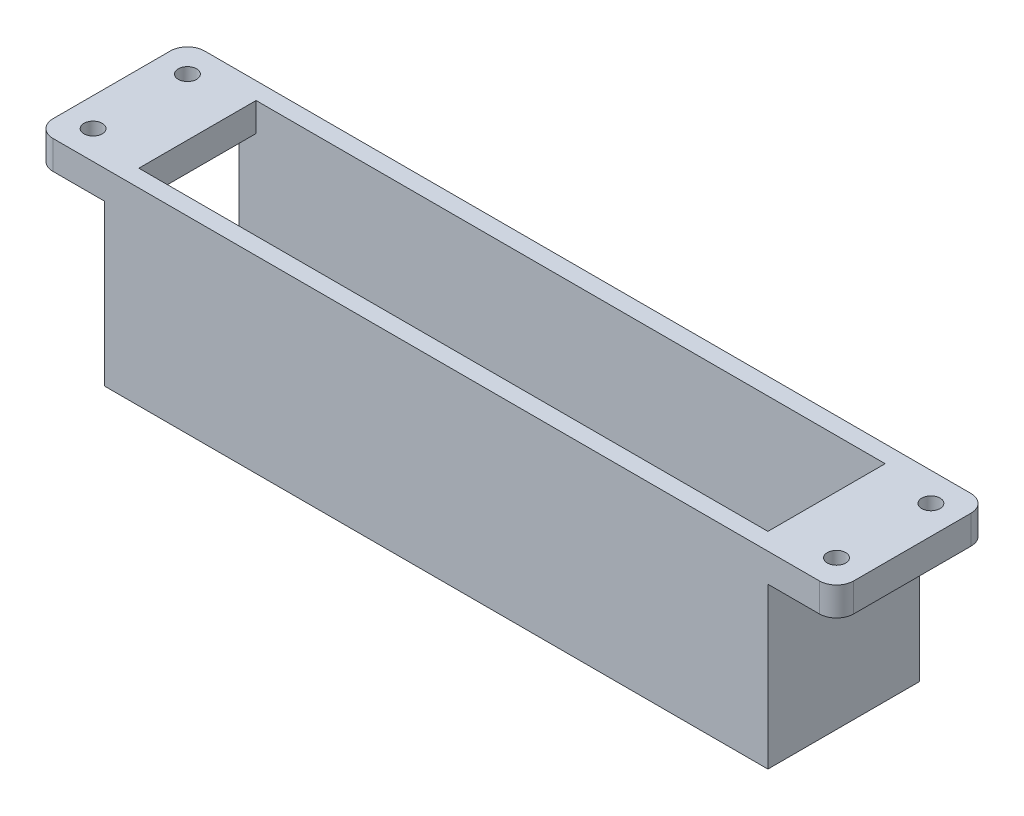
ISO-10303-21;
HEADER;
FILE_DESCRIPTION(('STEP AP214'),'2;1');
FILE_NAME('part.step','',(''),(''),'','','');
FILE_SCHEMA(('AUTOMOTIVE_DESIGN { 1 0 10303 214 1 1 1 1 }'));
ENDSEC;
DATA;
#1=APPLICATION_CONTEXT('core data for automotive mechanical design processes');
#2=APPLICATION_PROTOCOL_DEFINITION('international standard','automotive_design',2000,#1);
#3=PRODUCT_CONTEXT('',#1,'mechanical');
#4=PRODUCT('Part','Part','',(#3));
#5=PRODUCT_RELATED_PRODUCT_CATEGORY('part','',(#4));
#6=PRODUCT_DEFINITION_FORMATION('','',#4);
#7=PRODUCT_DEFINITION_CONTEXT('part definition',#1,'design');
#8=PRODUCT_DEFINITION('design','',#6,#7);
#9=PRODUCT_DEFINITION_SHAPE('','',#8);
#10=(LENGTH_UNIT() NAMED_UNIT(*) SI_UNIT(.MILLI.,.METRE.));
#11=(NAMED_UNIT(*) PLANE_ANGLE_UNIT() SI_UNIT($,.RADIAN.));
#12=(NAMED_UNIT(*) SI_UNIT($,.STERADIAN.) SOLID_ANGLE_UNIT());
#13=UNCERTAINTY_MEASURE_WITH_UNIT(LENGTH_MEASURE(1.E-05),#10,'distance_accuracy_value','');
#14=(GEOMETRIC_REPRESENTATION_CONTEXT(3) GLOBAL_UNCERTAINTY_ASSIGNED_CONTEXT((#13)) GLOBAL_UNIT_ASSIGNED_CONTEXT((#10,
#11,#12)) REPRESENTATION_CONTEXT('',''));
#15=CARTESIAN_POINT('',(0.,0.,0.));
#16=DIRECTION('',(0.,0.,1.));
#17=DIRECTION('',(1.,0.,0.));
#18=AXIS2_PLACEMENT_3D('',#15,#16,#17);
#19=CARTESIAN_POINT('',(0.,0.,26.5));
#20=DIRECTION('',(1.,0.,0.));
#21=DIRECTION('',(0.,0.,-1.));
#22=AXIS2_PLACEMENT_3D('',#19,#20,#21);
#23=PLANE('',#22);
#24=DIRECTION('',(0.,0.,1.));
#25=VECTOR('',#24,1.);
#26=CARTESIAN_POINT('',(0.,3.,3.));
#27=LINE('',#26,#25);
#28=CARTESIAN_POINT('',(0.,3.,3.));
#29=VERTEX_POINT('',#28);
#30=CARTESIAN_POINT('',(0.,3.,23.5));
#31=VERTEX_POINT('',#30);
#32=EDGE_CURVE('E344',#29,#31,#27,.T.);
#33=ORIENTED_EDGE('',*,*,#32,.F.);
#34=DIRECTION('',(0.,-1.,0.));
#35=VECTOR('',#34,1.);
#36=CARTESIAN_POINT('',(0.,28.,3.));
#37=LINE('',#36,#35);
#38=CARTESIAN_POINT('',(0.,28.,3.));
#39=VERTEX_POINT('',#38);
#40=EDGE_CURVE('E342',#39,#29,#37,.T.);
#41=ORIENTED_EDGE('',*,*,#40,.F.);
#42=DIRECTION('',(0.,0.,-1.));
#43=VECTOR('',#42,1.);
#44=CARTESIAN_POINT('',(0.,28.,26.5));
#45=LINE('',#44,#43);
#46=CARTESIAN_POINT('',(0.,28.,0.));
#47=VERTEX_POINT('',#46);
#48=EDGE_CURVE('E218',#39,#47,#45,.T.);
#49=ORIENTED_EDGE('',*,*,#48,.T.);
#50=DIRECTION('',(0.,-1.,0.));
#51=VECTOR('',#50,1.);
#52=CARTESIAN_POINT('',(0.,0.,0.));
#53=LINE('',#52,#51);
#54=CARTESIAN_POINT('',(0.,0.,0.));
#55=VERTEX_POINT('',#54);
#56=EDGE_CURVE('E200',#47,#55,#53,.T.);
#57=ORIENTED_EDGE('',*,*,#56,.T.);
#58=DIRECTION('',(0.,0.,-1.));
#59=VECTOR('',#58,1.);
#60=CARTESIAN_POINT('',(0.,0.,26.5));
#61=LINE('',#60,#59);
#62=CARTESIAN_POINT('',(0.,0.,26.5));
#63=VERTEX_POINT('',#62);
#64=EDGE_CURVE('E251',#63,#55,#61,.T.);
#65=ORIENTED_EDGE('',*,*,#64,.F.);
#66=DIRECTION('',(0.,-1.,0.));
#67=VECTOR('',#66,1.);
#68=CARTESIAN_POINT('',(0.,0.,26.5));
#69=LINE('',#68,#67);
#70=CARTESIAN_POINT('',(0.,28.,26.5));
#71=VERTEX_POINT('',#70);
#72=EDGE_CURVE('E202',#71,#63,#69,.T.);
#73=ORIENTED_EDGE('',*,*,#72,.F.);
#74=CARTESIAN_POINT('',(0.,28.,23.5));
#75=VERTEX_POINT('',#74);
#76=EDGE_CURVE('E232',#71,#75,#45,.T.);
#77=ORIENTED_EDGE('',*,*,#76,.T.);
#78=DIRECTION('',(0.,1.,0.));
#79=VECTOR('',#78,1.);
#80=CARTESIAN_POINT('',(0.,28.,23.5));
#81=LINE('',#80,#79);
#82=EDGE_CURVE('E172',#31,#75,#81,.T.);
#83=ORIENTED_EDGE('',*,*,#82,.F.);
#84=EDGE_LOOP('',(#33,#41,#49,#57,#65,#73,#77,#83));
#85=FACE_BOUND('',#84,.T.);
#86=ADVANCED_FACE('F41',(#85),#23,.F.);
#87=CARTESIAN_POINT('',(0.,0.,26.5));
#88=DIRECTION('',(0.,1.,0.));
#89=DIRECTION('',(0.,0.,1.));
#90=AXIS2_PLACEMENT_3D('',#87,#88,#89);
#91=PLANE('',#90);
#92=DIRECTION('',(1.,0.,0.));
#93=VECTOR('',#92,1.);
#94=CARTESIAN_POINT('',(0.,0.,0.));
#95=LINE('',#94,#93);
#96=CARTESIAN_POINT('',(116.,0.,0.));
#97=VERTEX_POINT('',#96);
#98=EDGE_CURVE('E221',#55,#97,#95,.T.);
#99=ORIENTED_EDGE('',*,*,#98,.T.);
#100=DIRECTION('',(0.,0.,-1.));
#101=VECTOR('',#100,1.);
#102=CARTESIAN_POINT('',(116.,0.,26.5));
#103=LINE('',#102,#101);
#104=CARTESIAN_POINT('',(116.,0.,26.5));
#105=VERTEX_POINT('',#104);
#106=EDGE_CURVE('E248',#105,#97,#103,.T.);
#107=ORIENTED_EDGE('',*,*,#106,.F.);
#108=DIRECTION('',(1.,0.,0.));
#109=VECTOR('',#108,1.);
#110=CARTESIAN_POINT('',(0.,0.,26.5));
#111=LINE('',#110,#109);
#112=EDGE_CURVE('E205',#63,#105,#111,.T.);
#113=ORIENTED_EDGE('',*,*,#112,.F.);
#114=ORIENTED_EDGE('',*,*,#64,.T.);
#115=EDGE_LOOP('',(#99,#107,#113,#114));
#116=FACE_BOUND('',#115,.T.);
#117=ADVANCED_FACE('F336',(#116),#91,.F.);
#118=CARTESIAN_POINT('',(116.,0.,26.5));
#119=DIRECTION('',(-1.,0.,0.));
#120=DIRECTION('',(0.,0.,1.));
#121=AXIS2_PLACEMENT_3D('',#118,#119,#120);
#122=PLANE('',#121);
#123=DIRECTION('',(0.,1.,0.));
#124=VECTOR('',#123,1.);
#125=CARTESIAN_POINT('',(116.,0.,0.));
#126=LINE('',#125,#124);
#127=CARTESIAN_POINT('',(116.,28.,0.));
#128=VERTEX_POINT('',#127);
#129=EDGE_CURVE('E223',#97,#128,#126,.T.);
#130=ORIENTED_EDGE('',*,*,#129,.T.);
#131=DIRECTION('',(0.,0.,-1.));
#132=VECTOR('',#131,1.);
#133=CARTESIAN_POINT('',(116.,28.,26.5));
#134=LINE('',#133,#132);
#135=CARTESIAN_POINT('',(116.,28.,26.5));
#136=VERTEX_POINT('',#135);
#137=EDGE_CURVE('E245',#136,#128,#134,.T.);
#138=ORIENTED_EDGE('',*,*,#137,.F.);
#139=DIRECTION('',(0.,1.,0.));
#140=VECTOR('',#139,1.);
#141=CARTESIAN_POINT('',(116.,0.,26.5));
#142=LINE('',#141,#140);
#143=EDGE_CURVE('E208',#105,#136,#142,.T.);
#144=ORIENTED_EDGE('',*,*,#143,.F.);
#145=ORIENTED_EDGE('',*,*,#106,.T.);
#146=EDGE_LOOP('',(#130,#138,#144,#145));
#147=FACE_BOUND('',#146,.T.);
#148=ADVANCED_FACE('F332',(#147),#122,.F.);
#149=CARTESIAN_POINT('',(128.,28.,26.5));
#150=DIRECTION('',(0.,1.,0.));
#151=DIRECTION('',(0.,0.,1.));
#152=AXIS2_PLACEMENT_3D('',#149,#150,#151);
#153=PLANE('',#152);
#154=CARTESIAN_POINT('',(123.,28.,21.5));
#155=DIRECTION('',(0.,1.,0.));
#156=DIRECTION('',(0.,0.,1.));
#157=AXIS2_PLACEMENT_3D('',#154,#155,#156);
#158=CIRCLE('',#157,1.60000000000005);
#159=CARTESIAN_POINT('',(123.,28.,23.1));
#160=VERTEX_POINT('',#159);
#161=EDGE_CURVE('E346',#160,#160,#158,.T.);
#162=ORIENTED_EDGE('',*,*,#161,.T.);
#163=EDGE_LOOP('',(#162));
#164=FACE_BOUND('',#163,.T.);
#165=CARTESIAN_POINT('',(123.,28.,5.));
#166=DIRECTION('',(0.,1.,0.));
#167=DIRECTION('',(0.,0.,1.));
#168=AXIS2_PLACEMENT_3D('',#165,#166,#167);
#169=CIRCLE('',#168,1.60000000000005);
#170=CARTESIAN_POINT('',(123.,28.,6.60000000000005));
#171=VERTEX_POINT('',#170);
#172=EDGE_CURVE('E262',#171,#171,#169,.T.);
#173=ORIENTED_EDGE('',*,*,#172,.T.);
#174=EDGE_LOOP('',(#173));
#175=FACE_BOUND('',#174,.T.);
#176=DIRECTION('',(1.,0.,0.));
#177=VECTOR('',#176,1.);
#178=CARTESIAN_POINT('',(128.,28.,0.));
#179=LINE('',#178,#177);
#180=CARTESIAN_POINT('',(125.,28.,0.));
#181=VERTEX_POINT('',#180);
#182=EDGE_CURVE('E225',#128,#181,#179,.T.);
#183=ORIENTED_EDGE('',*,*,#182,.T.);
#184=CARTESIAN_POINT('',(125.,28.,3.));
#185=DIRECTION('',(0.,1.,0.));
#186=DIRECTION('',(0.,0.,1.));
#187=AXIS2_PLACEMENT_3D('',#184,#185,#186);
#188=CIRCLE('',#187,3.);
#189=CARTESIAN_POINT('',(128.,28.,3.));
#190=VERTEX_POINT('',#189);
#191=EDGE_CURVE('E281',#181,#190,#188,.F.);
#192=ORIENTED_EDGE('',*,*,#191,.T.);
#193=DIRECTION('',(0.,0.,-1.));
#194=VECTOR('',#193,1.);
#195=CARTESIAN_POINT('',(128.,28.,26.5));
#196=LINE('',#195,#194);
#197=CARTESIAN_POINT('',(128.,28.,23.5));
#198=VERTEX_POINT('',#197);
#199=EDGE_CURVE('E242',#198,#190,#196,.T.);
#200=ORIENTED_EDGE('',*,*,#199,.F.);
#201=CARTESIAN_POINT('',(125.,28.,23.5));
#202=DIRECTION('',(0.,1.,0.));
#203=DIRECTION('',(0.,0.,1.));
#204=AXIS2_PLACEMENT_3D('',#201,#202,#203);
#205=CIRCLE('',#204,3.);
#206=CARTESIAN_POINT('',(125.,28.,26.5));
#207=VERTEX_POINT('',#206);
#208=EDGE_CURVE('E279',#198,#207,#205,.F.);
#209=ORIENTED_EDGE('',*,*,#208,.T.);
#210=DIRECTION('',(1.,0.,0.));
#211=VECTOR('',#210,1.);
#212=CARTESIAN_POINT('',(128.,28.,26.5));
#213=LINE('',#212,#211);
#214=EDGE_CURVE('E210',#136,#207,#213,.T.);
#215=ORIENTED_EDGE('',*,*,#214,.F.);
#216=ORIENTED_EDGE('',*,*,#137,.T.);
#217=EDGE_LOOP('',(#183,#192,#200,#209,#215,#216));
#218=FACE_BOUND('',#217,.T.);
#219=ADVANCED_FACE('F315',(#164,#175,#218),#153,.F.);
#220=CARTESIAN_POINT('',(128.,33.,26.5));
#221=DIRECTION('',(-1.,0.,0.));
#222=DIRECTION('',(0.,0.,1.));
#223=AXIS2_PLACEMENT_3D('',#220,#221,#222);
#224=PLANE('',#223);
#225=ORIENTED_EDGE('',*,*,#199,.T.);
#226=DIRECTION('',(0.,1.,0.));
#227=VECTOR('',#226,1.);
#228=CARTESIAN_POINT('',(128.,33.,3.));
#229=LINE('',#228,#227);
#230=CARTESIAN_POINT('',(128.,33.,3.));
#231=VERTEX_POINT('',#230);
#232=EDGE_CURVE('E264',#190,#231,#229,.T.);
#233=ORIENTED_EDGE('',*,*,#232,.T.);
#234=DIRECTION('',(0.,0.,-1.));
#235=VECTOR('',#234,1.);
#236=CARTESIAN_POINT('',(128.,33.,26.5));
#237=LINE('',#236,#235);
#238=CARTESIAN_POINT('',(128.,33.,23.5));
#239=VERTEX_POINT('',#238);
#240=EDGE_CURVE('E239',#239,#231,#237,.T.);
#241=ORIENTED_EDGE('',*,*,#240,.F.);
#242=DIRECTION('',(0.,1.,0.));
#243=VECTOR('',#242,1.);
#244=CARTESIAN_POINT('',(128.,33.,23.5));
#245=LINE('',#244,#243);
#246=EDGE_CURVE('E254',#239,#198,#245,.F.);
#247=ORIENTED_EDGE('',*,*,#246,.T.);
#248=EDGE_LOOP('',(#225,#233,#241,#247));
#249=FACE_BOUND('',#248,.T.);
#250=ADVANCED_FACE('F318',(#249),#224,.F.);
#251=CARTESIAN_POINT('',(128.,33.,26.5));
#252=DIRECTION('',(0.,-1.,0.));
#253=DIRECTION('',(0.,0.,-1.));
#254=AXIS2_PLACEMENT_3D('',#251,#252,#253);
#255=PLANE('',#254);
#256=CARTESIAN_POINT('',(-7.,33.,21.5));
#257=DIRECTION('',(0.,1.,0.));
#258=DIRECTION('',(-1.,0.,0.));
#259=AXIS2_PLACEMENT_3D('',#256,#257,#258);
#260=CIRCLE('',#259,1.6);
#261=CARTESIAN_POINT('',(-8.6,33.,21.5));
#262=VERTEX_POINT('',#261);
#263=EDGE_CURVE('E592',#262,#262,#260,.T.);
#264=ORIENTED_EDGE('',*,*,#263,.F.);
#265=EDGE_LOOP('',(#264));
#266=FACE_BOUND('',#265,.T.);
#267=CARTESIAN_POINT('',(123.,33.,21.5));
#268=DIRECTION('',(0.,1.,0.));
#269=DIRECTION('',(-1.,0.,0.));
#270=AXIS2_PLACEMENT_3D('',#267,#268,#269);
#271=CIRCLE('',#270,1.60000000000005);
#272=CARTESIAN_POINT('',(121.4,33.,21.5));
#273=VERTEX_POINT('',#272);
#274=EDGE_CURVE('E595',#273,#273,#271,.T.);
#275=ORIENTED_EDGE('',*,*,#274,.F.);
#276=EDGE_LOOP('',(#275));
#277=FACE_BOUND('',#276,.T.);
#278=CARTESIAN_POINT('',(123.,33.,5.));
#279=DIRECTION('',(0.,1.,0.));
#280=DIRECTION('',(-1.,0.,0.));
#281=AXIS2_PLACEMENT_3D('',#278,#279,#280);
#282=CIRCLE('',#281,1.60000000000005);
#283=CARTESIAN_POINT('',(121.4,33.,5.));
#284=VERTEX_POINT('',#283);
#285=EDGE_CURVE('E591',#284,#284,#282,.T.);
#286=ORIENTED_EDGE('',*,*,#285,.F.);
#287=EDGE_LOOP('',(#286));
#288=FACE_BOUND('',#287,.T.);
#289=CARTESIAN_POINT('',(-7.,33.,5.));
#290=DIRECTION('',(0.,1.,0.));
#291=DIRECTION('',(-1.,0.,0.));
#292=AXIS2_PLACEMENT_3D('',#289,#290,#291);
#293=CIRCLE('',#292,1.6);
#294=CARTESIAN_POINT('',(-8.6,33.,5.));
#295=VERTEX_POINT('',#294);
#296=EDGE_CURVE('E259',#295,#295,#293,.T.);
#297=ORIENTED_EDGE('',*,*,#296,.F.);
#298=EDGE_LOOP('',(#297));
#299=FACE_BOUND('',#298,.T.);
#300=DIRECTION('',(1.,0.,0.));
#301=VECTOR('',#300,1.);
#302=CARTESIAN_POINT('',(3.,33.,23.5));
#303=LINE('',#302,#301);
#304=CARTESIAN_POINT('',(3.,33.,23.5));
#305=VERTEX_POINT('',#304);
#306=CARTESIAN_POINT('',(113.,33.,23.5));
#307=VERTEX_POINT('',#306);
#308=EDGE_CURVE('E359',#305,#307,#303,.T.);
#309=ORIENTED_EDGE('',*,*,#308,.F.);
#310=DIRECTION('',(0.,0.,1.));
#311=VECTOR('',#310,1.);
#312=CARTESIAN_POINT('',(3.,33.,3.));
#313=LINE('',#312,#311);
#314=CARTESIAN_POINT('',(3.,33.,3.));
#315=VERTEX_POINT('',#314);
#316=EDGE_CURVE('E186',#315,#305,#313,.T.);
#317=ORIENTED_EDGE('',*,*,#316,.F.);
#318=DIRECTION('',(-1.,0.,0.));
#319=VECTOR('',#318,1.);
#320=CARTESIAN_POINT('',(3.,33.,3.));
#321=LINE('',#320,#319);
#322=CARTESIAN_POINT('',(113.,33.,3.));
#323=VERTEX_POINT('',#322);
#324=EDGE_CURVE('E189',#323,#315,#321,.T.);
#325=ORIENTED_EDGE('',*,*,#324,.F.);
#326=DIRECTION('',(0.,0.,-1.));
#327=VECTOR('',#326,1.);
#328=CARTESIAN_POINT('',(113.,33.,3.));
#329=LINE('',#328,#327);
#330=EDGE_CURVE('E194',#307,#323,#329,.T.);
#331=ORIENTED_EDGE('',*,*,#330,.F.);
#332=EDGE_LOOP('',(#309,#317,#325,#331));
#333=FACE_BOUND('',#332,.T.);
#334=ORIENTED_EDGE('',*,*,#240,.T.);
#335=CARTESIAN_POINT('',(125.,33.,3.));
#336=DIRECTION('',(0.,-1.,0.));
#337=DIRECTION('',(0.,0.,-1.));
#338=AXIS2_PLACEMENT_3D('',#335,#336,#337);
#339=CIRCLE('',#338,3.);
#340=CARTESIAN_POINT('',(125.,33.,0.));
#341=VERTEX_POINT('',#340);
#342=EDGE_CURVE('E273',#231,#341,#339,.F.);
#343=ORIENTED_EDGE('',*,*,#342,.T.);
#344=DIRECTION('',(-1.,0.,0.));
#345=VECTOR('',#344,1.);
#346=CARTESIAN_POINT('',(128.,33.,0.));
#347=LINE('',#346,#345);
#348=CARTESIAN_POINT('',(-9.00000000000001,33.,0.));
#349=VERTEX_POINT('',#348);
#350=EDGE_CURVE('E228',#341,#349,#347,.T.);
#351=ORIENTED_EDGE('',*,*,#350,.T.);
#352=CARTESIAN_POINT('',(-9.,33.,3.));
#353=DIRECTION('',(0.,-1.,0.));
#354=DIRECTION('',(0.,0.,-1.));
#355=AXIS2_PLACEMENT_3D('',#352,#353,#354);
#356=CIRCLE('',#355,3.);
#357=CARTESIAN_POINT('',(-12.,33.,3.));
#358=VERTEX_POINT('',#357);
#359=EDGE_CURVE('E269',#349,#358,#356,.F.);
#360=ORIENTED_EDGE('',*,*,#359,.T.);
#361=DIRECTION('',(0.,0.,-1.));
#362=VECTOR('',#361,1.);
#363=CARTESIAN_POINT('',(-12.,33.,26.5));
#364=LINE('',#363,#362);
#365=CARTESIAN_POINT('',(-12.,33.,23.5));
#366=VERTEX_POINT('',#365);
#367=EDGE_CURVE('E236',#366,#358,#364,.T.);
#368=ORIENTED_EDGE('',*,*,#367,.F.);
#369=CARTESIAN_POINT('',(-9.,33.,23.5));
#370=DIRECTION('',(0.,-1.,0.));
#371=DIRECTION('',(0.,0.,-1.));
#372=AXIS2_PLACEMENT_3D('',#369,#370,#371);
#373=CIRCLE('',#372,3.);
#374=CARTESIAN_POINT('',(-9.00000000000001,33.,26.5));
#375=VERTEX_POINT('',#374);
#376=EDGE_CURVE('E267',#366,#375,#373,.F.);
#377=ORIENTED_EDGE('',*,*,#376,.T.);
#378=DIRECTION('',(-1.,0.,0.));
#379=VECTOR('',#378,1.);
#380=CARTESIAN_POINT('',(128.,33.,26.5));
#381=LINE('',#380,#379);
#382=CARTESIAN_POINT('',(125.,33.,26.5));
#383=VERTEX_POINT('',#382);
#384=EDGE_CURVE('E213',#383,#375,#381,.T.);
#385=ORIENTED_EDGE('',*,*,#384,.F.);
#386=CARTESIAN_POINT('',(125.,33.,23.5));
#387=DIRECTION('',(0.,-1.,0.));
#388=DIRECTION('',(0.,0.,-1.));
#389=AXIS2_PLACEMENT_3D('',#386,#387,#388);
#390=CIRCLE('',#389,3.);
#391=EDGE_CURVE('E271',#383,#239,#390,.F.);
#392=ORIENTED_EDGE('',*,*,#391,.T.);
#393=EDGE_LOOP('',(#334,#343,#351,#360,#368,#377,#385,#392));
#394=FACE_BOUND('',#393,.T.);
#395=ADVANCED_FACE('F305',(#266,#277,#288,#299,#333,#394),#255,.F.);
#396=CARTESIAN_POINT('',(-12.,33.,26.5));
#397=DIRECTION('',(1.,0.,0.));
#398=DIRECTION('',(0.,0.,-1.));
#399=AXIS2_PLACEMENT_3D('',#396,#397,#398);
#400=PLANE('',#399);
#401=ORIENTED_EDGE('',*,*,#367,.T.);
#402=DIRECTION('',(0.,-1.,0.));
#403=VECTOR('',#402,1.);
#404=CARTESIAN_POINT('',(-12.,28.,3.));
#405=LINE('',#404,#403);
#406=CARTESIAN_POINT('',(-12.,28.,3.));
#407=VERTEX_POINT('',#406);
#408=EDGE_CURVE('E291',#358,#407,#405,.T.);
#409=ORIENTED_EDGE('',*,*,#408,.T.);
#410=DIRECTION('',(0.,0.,-1.));
#411=VECTOR('',#410,1.);
#412=CARTESIAN_POINT('',(-12.,28.,26.5));
#413=LINE('',#412,#411);
#414=CARTESIAN_POINT('',(-12.,28.,23.5));
#415=VERTEX_POINT('',#414);
#416=EDGE_CURVE('E234',#415,#407,#413,.T.);
#417=ORIENTED_EDGE('',*,*,#416,.F.);
#418=DIRECTION('',(0.,-1.,0.));
#419=VECTOR('',#418,1.);
#420=CARTESIAN_POINT('',(-12.,33.,23.5));
#421=LINE('',#420,#419);
#422=EDGE_CURVE('E289',#415,#366,#421,.F.);
#423=ORIENTED_EDGE('',*,*,#422,.T.);
#424=EDGE_LOOP('',(#401,#409,#417,#423));
#425=FACE_BOUND('',#424,.T.);
#426=ADVANCED_FACE('F293',(#425),#400,.F.);
#427=CARTESIAN_POINT('',(-12.,28.,26.5));
#428=DIRECTION('',(0.,1.,0.));
#429=DIRECTION('',(0.,0.,1.));
#430=AXIS2_PLACEMENT_3D('',#427,#428,#429);
#431=PLANE('',#430);
#432=CARTESIAN_POINT('',(-7.,28.,21.5));
#433=DIRECTION('',(0.,1.,0.));
#434=DIRECTION('',(0.,0.,1.));
#435=AXIS2_PLACEMENT_3D('',#432,#433,#434);
#436=CIRCLE('',#435,1.6);
#437=CARTESIAN_POINT('',(-7.,28.,23.1));
#438=VERTEX_POINT('',#437);
#439=EDGE_CURVE('E258',#438,#438,#436,.T.);
#440=ORIENTED_EDGE('',*,*,#439,.T.);
#441=EDGE_LOOP('',(#440));
#442=FACE_BOUND('',#441,.T.);
#443=CARTESIAN_POINT('',(-7.,28.,5.));
#444=DIRECTION('',(0.,1.,0.));
#445=DIRECTION('',(0.,0.,1.));
#446=AXIS2_PLACEMENT_3D('',#443,#444,#445);
#447=CIRCLE('',#446,1.6);
#448=CARTESIAN_POINT('',(-7.,28.,6.6));
#449=VERTEX_POINT('',#448);
#450=EDGE_CURVE('E255',#449,#449,#447,.T.);
#451=ORIENTED_EDGE('',*,*,#450,.T.);
#452=EDGE_LOOP('',(#451));
#453=FACE_BOUND('',#452,.T.);
#454=ORIENTED_EDGE('',*,*,#416,.T.);
#455=CARTESIAN_POINT('',(-9.,28.,3.));
#456=DIRECTION('',(0.,1.,0.));
#457=DIRECTION('',(0.,0.,1.));
#458=AXIS2_PLACEMENT_3D('',#455,#456,#457);
#459=CIRCLE('',#458,3.);
#460=CARTESIAN_POINT('',(-9.,28.,0.));
#461=VERTEX_POINT('',#460);
#462=EDGE_CURVE('E12',#407,#461,#459,.F.);
#463=ORIENTED_EDGE('',*,*,#462,.T.);
#464=DIRECTION('',(1.,0.,0.));
#465=VECTOR('',#464,1.);
#466=CARTESIAN_POINT('',(-12.,28.,0.));
#467=LINE('',#466,#465);
#468=EDGE_CURVE('E206',#461,#47,#467,.T.);
#469=ORIENTED_EDGE('',*,*,#468,.T.);
#470=ORIENTED_EDGE('',*,*,#48,.F.);
#471=DIRECTION('',(-1.,0.,0.));
#472=VECTOR('',#471,1.);
#473=CARTESIAN_POINT('',(3.,28.,3.));
#474=LINE('',#473,#472);
#475=CARTESIAN_POINT('',(3.,28.,3.));
#476=VERTEX_POINT('',#475);
#477=EDGE_CURVE('E175',#476,#39,#474,.T.);
#478=ORIENTED_EDGE('',*,*,#477,.F.);
#479=DIRECTION('',(0.,0.,-1.));
#480=VECTOR('',#479,1.);
#481=CARTESIAN_POINT('',(3.,28.,3.));
#482=LINE('',#481,#480);
#483=CARTESIAN_POINT('',(3.,28.,23.5));
#484=VERTEX_POINT('',#483);
#485=EDGE_CURVE('E176',#484,#476,#482,.T.);
#486=ORIENTED_EDGE('',*,*,#485,.F.);
#487=DIRECTION('',(-1.,0.,0.));
#488=VECTOR('',#487,1.);
#489=CARTESIAN_POINT('',(3.,28.,23.5));
#490=LINE('',#489,#488);
#491=EDGE_CURVE('E164',#484,#75,#490,.T.);
#492=ORIENTED_EDGE('',*,*,#491,.T.);
#493=ORIENTED_EDGE('',*,*,#76,.F.);
#494=DIRECTION('',(1.,0.,0.));
#495=VECTOR('',#494,1.);
#496=CARTESIAN_POINT('',(-12.,28.,26.5));
#497=LINE('',#496,#495);
#498=CARTESIAN_POINT('',(-9.,28.,26.5));
#499=VERTEX_POINT('',#498);
#500=EDGE_CURVE('E216',#499,#71,#497,.T.);
#501=ORIENTED_EDGE('',*,*,#500,.F.);
#502=CARTESIAN_POINT('',(-9.,28.,23.5));
#503=DIRECTION('',(0.,1.,0.));
#504=DIRECTION('',(0.,0.,1.));
#505=AXIS2_PLACEMENT_3D('',#502,#503,#504);
#506=CIRCLE('',#505,3.);
#507=EDGE_CURVE('E49',#499,#415,#506,.F.);
#508=ORIENTED_EDGE('',*,*,#507,.T.);
#509=EDGE_LOOP('',(#454,#463,#469,#470,#478,#486,#492,#493,#501,#508));
#510=FACE_BOUND('',#509,.T.);
#511=ADVANCED_FACE('F179',(#442,#453,#510),#431,.F.);
#512=CARTESIAN_POINT('',(0.,0.,26.5));
#513=DIRECTION('',(0.,0.,-1.));
#514=DIRECTION('',(-1.,0.,0.));
#515=AXIS2_PLACEMENT_3D('',#512,#513,#514);
#516=PLANE('',#515);
#517=ORIENTED_EDGE('',*,*,#214,.T.);
#518=DIRECTION('',(0.,1.,0.));
#519=VECTOR('',#518,1.);
#520=CARTESIAN_POINT('',(125.,0.,26.5));
#521=LINE('',#520,#519);
#522=EDGE_CURVE('E286',#207,#383,#521,.T.);
#523=ORIENTED_EDGE('',*,*,#522,.T.);
#524=ORIENTED_EDGE('',*,*,#384,.T.);
#525=DIRECTION('',(0.,-1.,0.));
#526=VECTOR('',#525,1.);
#527=CARTESIAN_POINT('',(-9.,0.,26.5));
#528=LINE('',#527,#526);
#529=EDGE_CURVE('E283',#375,#499,#528,.T.);
#530=ORIENTED_EDGE('',*,*,#529,.T.);
#531=ORIENTED_EDGE('',*,*,#500,.T.);
#532=ORIENTED_EDGE('',*,*,#72,.T.);
#533=ORIENTED_EDGE('',*,*,#112,.T.);
#534=ORIENTED_EDGE('',*,*,#143,.T.);
#535=EDGE_LOOP('',(#517,#523,#524,#530,#531,#532,#533,#534));
#536=FACE_BOUND('',#535,.T.);
#537=ADVANCED_FACE('F326',(#536),#516,.F.);
#538=CARTESIAN_POINT('',(0.,0.,0.));
#539=DIRECTION('',(0.,0.,-1.));
#540=DIRECTION('',(-1.,0.,0.));
#541=AXIS2_PLACEMENT_3D('',#538,#539,#540);
#542=PLANE('',#541);
#543=ORIENTED_EDGE('',*,*,#350,.F.);
#544=DIRECTION('',(0.,1.,0.));
#545=VECTOR('',#544,1.);
#546=CARTESIAN_POINT('',(125.,28.,0.));
#547=LINE('',#546,#545);
#548=EDGE_CURVE('E277',#341,#181,#547,.F.);
#549=ORIENTED_EDGE('',*,*,#548,.T.);
#550=ORIENTED_EDGE('',*,*,#182,.F.);
#551=ORIENTED_EDGE('',*,*,#129,.F.);
#552=ORIENTED_EDGE('',*,*,#98,.F.);
#553=ORIENTED_EDGE('',*,*,#56,.F.);
#554=ORIENTED_EDGE('',*,*,#468,.F.);
#555=DIRECTION('',(0.,-1.,0.));
#556=VECTOR('',#555,1.);
#557=CARTESIAN_POINT('',(-9.,33.,0.));
#558=LINE('',#557,#556);
#559=EDGE_CURVE('E275',#461,#349,#558,.F.);
#560=ORIENTED_EDGE('',*,*,#559,.T.);
#561=EDGE_LOOP('',(#543,#549,#550,#551,#552,#553,#554,#560));
#562=FACE_BOUND('',#561,.T.);
#563=ADVANCED_FACE('F302',(#562),#542,.T.);
#564=CARTESIAN_POINT('',(3.00000000000002,-111.893922980652,3.));
#565=DIRECTION('',(-1.,0.,0.));
#566=DIRECTION('',(0.,-1.,0.));
#567=AXIS2_PLACEMENT_3D('',#564,#565,#566);
#568=PLANE('',#567);
#569=DIRECTION('',(0.,1.,0.));
#570=VECTOR('',#569,1.);
#571=CARTESIAN_POINT('',(3.00000000000002,-111.893922980652,23.5));
#572=LINE('',#571,#570);
#573=EDGE_CURVE('E169',#484,#305,#572,.T.);
#574=ORIENTED_EDGE('',*,*,#573,.F.);
#575=ORIENTED_EDGE('',*,*,#485,.T.);
#576=DIRECTION('',(0.,1.,0.));
#577=VECTOR('',#576,1.);
#578=CARTESIAN_POINT('',(3.00000000000002,-111.893922980652,3.));
#579=LINE('',#578,#577);
#580=EDGE_CURVE('E356',#476,#315,#579,.T.);
#581=ORIENTED_EDGE('',*,*,#580,.T.);
#582=ORIENTED_EDGE('',*,*,#316,.T.);
#583=EDGE_LOOP('',(#574,#575,#581,#582));
#584=FACE_BOUND('',#583,.T.);
#585=ADVANCED_FACE('F184',(#584),#568,.F.);
#586=CARTESIAN_POINT('',(3.00000000000002,-111.893922980652,3.));
#587=DIRECTION('',(0.,0.,-1.));
#588=DIRECTION('',(-1.,0.,0.));
#589=AXIS2_PLACEMENT_3D('',#586,#587,#588);
#590=PLANE('',#589);
#591=DIRECTION('',(1.,0.,0.));
#592=VECTOR('',#591,1.);
#593=CARTESIAN_POINT('',(3.00000000000002,3.,3.));
#594=LINE('',#593,#592);
#595=CARTESIAN_POINT('',(113.,3.,3.));
#596=VERTEX_POINT('',#595);
#597=EDGE_CURVE('E201',#29,#596,#594,.T.);
#598=ORIENTED_EDGE('',*,*,#597,.T.);
#599=DIRECTION('',(0.,1.,0.));
#600=VECTOR('',#599,1.);
#601=CARTESIAN_POINT('',(113.,-111.893922980652,3.));
#602=LINE('',#601,#600);
#603=EDGE_CURVE('E191',#596,#323,#602,.T.);
#604=ORIENTED_EDGE('',*,*,#603,.T.);
#605=ORIENTED_EDGE('',*,*,#324,.T.);
#606=ORIENTED_EDGE('',*,*,#580,.F.);
#607=ORIENTED_EDGE('',*,*,#477,.T.);
#608=ORIENTED_EDGE('',*,*,#40,.T.);
#609=EDGE_LOOP('',(#598,#604,#605,#606,#607,#608));
#610=FACE_BOUND('',#609,.T.);
#611=ADVANCED_FACE('F364',(#610),#590,.F.);
#612=CARTESIAN_POINT('',(113.,-111.893922980652,3.));
#613=DIRECTION('',(1.,0.,0.));
#614=DIRECTION('',(0.,1.,0.));
#615=AXIS2_PLACEMENT_3D('',#612,#613,#614);
#616=PLANE('',#615);
#617=DIRECTION('',(0.,0.,1.));
#618=VECTOR('',#617,1.);
#619=CARTESIAN_POINT('',(113.,3.,3.));
#620=LINE('',#619,#618);
#621=CARTESIAN_POINT('',(113.,3.,23.5));
#622=VERTEX_POINT('',#621);
#623=EDGE_CURVE('E354',#596,#622,#620,.T.);
#624=ORIENTED_EDGE('',*,*,#623,.T.);
#625=DIRECTION('',(0.,1.,0.));
#626=VECTOR('',#625,1.);
#627=CARTESIAN_POINT('',(113.,-111.893922980652,23.5));
#628=LINE('',#627,#626);
#629=EDGE_CURVE('E188',#622,#307,#628,.T.);
#630=ORIENTED_EDGE('',*,*,#629,.T.);
#631=ORIENTED_EDGE('',*,*,#330,.T.);
#632=ORIENTED_EDGE('',*,*,#603,.F.);
#633=EDGE_LOOP('',(#624,#630,#631,#632));
#634=FACE_BOUND('',#633,.T.);
#635=ADVANCED_FACE('F369',(#634),#616,.F.);
#636=CARTESIAN_POINT('',(3.00000000000002,-111.893922980652,23.5));
#637=DIRECTION('',(0.,0.,1.));
#638=DIRECTION('',(1.,0.,0.));
#639=AXIS2_PLACEMENT_3D('',#636,#637,#638);
#640=PLANE('',#639);
#641=DIRECTION('',(-1.,0.,0.));
#642=VECTOR('',#641,1.);
#643=CARTESIAN_POINT('',(3.00000000000002,3.,23.5));
#644=LINE('',#643,#642);
#645=EDGE_CURVE('E198',#622,#31,#644,.T.);
#646=ORIENTED_EDGE('',*,*,#645,.T.);
#647=ORIENTED_EDGE('',*,*,#82,.T.);
#648=ORIENTED_EDGE('',*,*,#491,.F.);
#649=ORIENTED_EDGE('',*,*,#573,.T.);
#650=ORIENTED_EDGE('',*,*,#308,.T.);
#651=ORIENTED_EDGE('',*,*,#629,.F.);
#652=EDGE_LOOP('',(#646,#647,#648,#649,#650,#651));
#653=FACE_BOUND('',#652,.T.);
#654=ADVANCED_FACE('F166',(#653),#640,.F.);
#655=CARTESIAN_POINT('',(0.,3.,26.5));
#656=DIRECTION('',(0.,1.,0.));
#657=DIRECTION('',(0.,0.,1.));
#658=AXIS2_PLACEMENT_3D('',#655,#656,#657);
#659=PLANE('',#658);
#660=ORIENTED_EDGE('',*,*,#597,.F.);
#661=ORIENTED_EDGE('',*,*,#32,.T.);
#662=ORIENTED_EDGE('',*,*,#645,.F.);
#663=ORIENTED_EDGE('',*,*,#623,.F.);
#664=EDGE_LOOP('',(#660,#661,#662,#663));
#665=FACE_BOUND('',#664,.T.);
#666=ADVANCED_FACE('F374',(#665),#659,.T.);
#667=CARTESIAN_POINT('',(-6.99999999999999,0.,5.));
#668=DIRECTION('',(0.,1.,0.));
#669=DIRECTION('',(-1.,0.,0.));
#670=AXIS2_PLACEMENT_3D('',#667,#668,#669);
#671=CYLINDRICAL_SURFACE('',#670,1.6);
#672=ORIENTED_EDGE('',*,*,#296,.T.);
#673=EDGE_LOOP('',(#672));
#674=FACE_BOUND('',#673,.T.);
#675=ORIENTED_EDGE('',*,*,#450,.F.);
#676=EDGE_LOOP('',(#675));
#677=FACE_BOUND('',#676,.T.);
#678=ADVANCED_FACE('F441',(#674,#677),#671,.F.);
#679=CARTESIAN_POINT('',(-6.99999999999999,0.,21.5));
#680=DIRECTION('',(0.,1.,0.));
#681=DIRECTION('',(-1.,0.,0.));
#682=AXIS2_PLACEMENT_3D('',#679,#680,#681);
#683=CYLINDRICAL_SURFACE('',#682,1.6);
#684=ORIENTED_EDGE('',*,*,#263,.T.);
#685=EDGE_LOOP('',(#684));
#686=FACE_BOUND('',#685,.T.);
#687=ORIENTED_EDGE('',*,*,#439,.F.);
#688=EDGE_LOOP('',(#687));
#689=FACE_BOUND('',#688,.T.);
#690=ADVANCED_FACE('F432',(#686,#689),#683,.F.);
#691=CARTESIAN_POINT('',(123.,0.,5.));
#692=DIRECTION('',(0.,1.,0.));
#693=DIRECTION('',(-1.,0.,0.));
#694=AXIS2_PLACEMENT_3D('',#691,#692,#693);
#695=CYLINDRICAL_SURFACE('',#694,1.60000000000005);
#696=ORIENTED_EDGE('',*,*,#285,.T.);
#697=EDGE_LOOP('',(#696));
#698=FACE_BOUND('',#697,.T.);
#699=ORIENTED_EDGE('',*,*,#172,.F.);
#700=EDGE_LOOP('',(#699));
#701=FACE_BOUND('',#700,.T.);
#702=ADVANCED_FACE('F423',(#698,#701),#695,.F.);
#703=CARTESIAN_POINT('',(123.,0.,21.5));
#704=DIRECTION('',(0.,1.,0.));
#705=DIRECTION('',(-1.,0.,0.));
#706=AXIS2_PLACEMENT_3D('',#703,#704,#705);
#707=CYLINDRICAL_SURFACE('',#706,1.60000000000005);
#708=ORIENTED_EDGE('',*,*,#274,.T.);
#709=EDGE_LOOP('',(#708));
#710=FACE_BOUND('',#709,.T.);
#711=ORIENTED_EDGE('',*,*,#161,.F.);
#712=EDGE_LOOP('',(#711));
#713=FACE_BOUND('',#712,.T.);
#714=ADVANCED_FACE('F393',(#710,#713),#707,.F.);
#715=CARTESIAN_POINT('',(125.,33.,3.));
#716=DIRECTION('',(0.,-1.,0.));
#717=DIRECTION('',(0.,0.,-1.));
#718=AXIS2_PLACEMENT_3D('',#715,#716,#717);
#719=CYLINDRICAL_SURFACE('',#718,3.);
#720=ORIENTED_EDGE('',*,*,#191,.F.);
#721=ORIENTED_EDGE('',*,*,#548,.F.);
#722=ORIENTED_EDGE('',*,*,#342,.F.);
#723=ORIENTED_EDGE('',*,*,#232,.F.);
#724=EDGE_LOOP('',(#720,#721,#722,#723));
#725=FACE_BOUND('',#724,.T.);
#726=ADVANCED_FACE('F311',(#725),#719,.T.);
#727=CARTESIAN_POINT('',(125.,0.,23.5));
#728=DIRECTION('',(0.,1.,0.));
#729=DIRECTION('',(0.,0.,1.));
#730=AXIS2_PLACEMENT_3D('',#727,#728,#729);
#731=CYLINDRICAL_SURFACE('',#730,3.);
#732=ORIENTED_EDGE('',*,*,#208,.F.);
#733=ORIENTED_EDGE('',*,*,#246,.F.);
#734=ORIENTED_EDGE('',*,*,#391,.F.);
#735=ORIENTED_EDGE('',*,*,#522,.F.);
#736=EDGE_LOOP('',(#732,#733,#734,#735));
#737=FACE_BOUND('',#736,.T.);
#738=ADVANCED_FACE('F322',(#737),#731,.T.);
#739=CARTESIAN_POINT('',(-9.,33.,3.));
#740=DIRECTION('',(0.,1.,0.));
#741=DIRECTION('',(0.,0.,1.));
#742=AXIS2_PLACEMENT_3D('',#739,#740,#741);
#743=CYLINDRICAL_SURFACE('',#742,3.);
#744=ORIENTED_EDGE('',*,*,#359,.F.);
#745=ORIENTED_EDGE('',*,*,#559,.F.);
#746=ORIENTED_EDGE('',*,*,#462,.F.);
#747=ORIENTED_EDGE('',*,*,#408,.F.);
#748=EDGE_LOOP('',(#744,#745,#746,#747));
#749=FACE_BOUND('',#748,.T.);
#750=ADVANCED_FACE('F303',(#749),#743,.T.);
#751=CARTESIAN_POINT('',(-9.,0.,23.5));
#752=DIRECTION('',(0.,-1.,0.));
#753=DIRECTION('',(0.,0.,-1.));
#754=AXIS2_PLACEMENT_3D('',#751,#752,#753);
#755=CYLINDRICAL_SURFACE('',#754,3.);
#756=ORIENTED_EDGE('',*,*,#376,.F.);
#757=ORIENTED_EDGE('',*,*,#422,.F.);
#758=ORIENTED_EDGE('',*,*,#507,.F.);
#759=ORIENTED_EDGE('',*,*,#529,.F.);
#760=EDGE_LOOP('',(#756,#757,#758,#759));
#761=FACE_BOUND('',#760,.T.);
#762=ADVANCED_FACE('F43',(#761),#755,.T.);
#763=CLOSED_SHELL('',(#86,#117,#148,#219,#250,#395,#426,#511,#537,#563,#585,#611,#635,#654,#666,
#678,#690,#702,#714,#726,#738,#750,#762));
#764=MANIFOLD_SOLID_BREP('B2',#763);
#765=ADVANCED_BREP_SHAPE_REPRESENTATION('',(#18,#764),#14);
#766=SHAPE_DEFINITION_REPRESENTATION(#9,#765);
ENDSEC;
END-ISO-10303-21;
